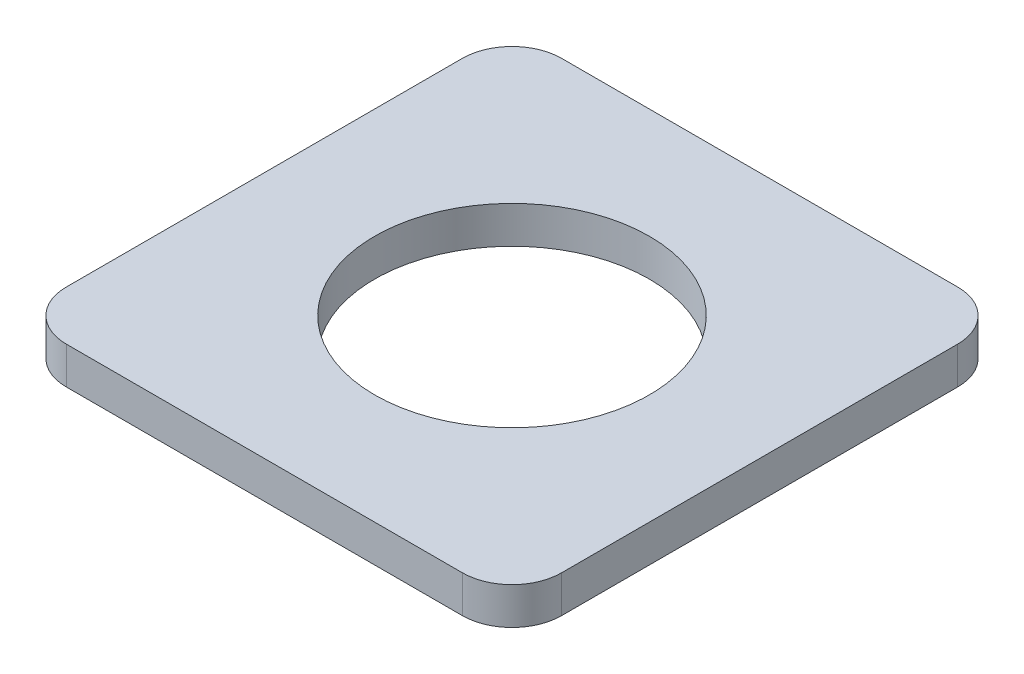
ISO-10303-21;
HEADER;
FILE_DESCRIPTION(('STEP AP214'),'2;1');
FILE_NAME('part.step','',(''),(''),'','','');
FILE_SCHEMA(('AUTOMOTIVE_DESIGN { 1 0 10303 214 1 1 1 1 }'));
ENDSEC;
DATA;
#1=APPLICATION_CONTEXT('core data for automotive mechanical design processes');
#2=APPLICATION_PROTOCOL_DEFINITION('international standard','automotive_design',2000,#1);
#3=PRODUCT_CONTEXT('',#1,'mechanical');
#4=PRODUCT('Part','Part','',(#3));
#5=PRODUCT_RELATED_PRODUCT_CATEGORY('part','',(#4));
#6=PRODUCT_DEFINITION_FORMATION('','',#4);
#7=PRODUCT_DEFINITION_CONTEXT('part definition',#1,'design');
#8=PRODUCT_DEFINITION('design','',#6,#7);
#9=PRODUCT_DEFINITION_SHAPE('','',#8);
#10=(LENGTH_UNIT() NAMED_UNIT(*) SI_UNIT(.MILLI.,.METRE.));
#11=(NAMED_UNIT(*) PLANE_ANGLE_UNIT() SI_UNIT($,.RADIAN.));
#12=(NAMED_UNIT(*) SI_UNIT($,.STERADIAN.) SOLID_ANGLE_UNIT());
#13=UNCERTAINTY_MEASURE_WITH_UNIT(LENGTH_MEASURE(1.E-05),#10,'distance_accuracy_value','');
#14=(GEOMETRIC_REPRESENTATION_CONTEXT(3) GLOBAL_UNCERTAINTY_ASSIGNED_CONTEXT((#13)) GLOBAL_UNIT_ASSIGNED_CONTEXT((#10,
#11,#12)) REPRESENTATION_CONTEXT('',''));
#15=CARTESIAN_POINT('',(0.,0.,0.));
#16=DIRECTION('',(0.,0.,1.));
#17=DIRECTION('',(1.,0.,0.));
#18=AXIS2_PLACEMENT_3D('',#15,#16,#17);
#19=CARTESIAN_POINT('',(-16.,3.,16.));
#20=DIRECTION('',(0.,-1.,0.));
#21=DIRECTION('',(0.,0.,-1.));
#22=AXIS2_PLACEMENT_3D('',#19,#20,#21);
#23=PLANE('',#22);
#24=CARTESIAN_POINT('',(-16.,3.,16.));
#25=DIRECTION('',(0.,1.,0.));
#26=DIRECTION('',(0.,0.,-1.));
#27=AXIS2_PLACEMENT_3D('',#24,#25,#26);
#28=CIRCLE('',#27,4.);
#29=CARTESIAN_POINT('',(-20.,3.,16.));
#30=VERTEX_POINT('',#29);
#31=CARTESIAN_POINT('',(-16.,3.,20.));
#32=VERTEX_POINT('',#31);
#33=EDGE_CURVE('E170',#30,#32,#28,.T.);
#34=ORIENTED_EDGE('',*,*,#33,.T.);
#35=DIRECTION('',(1.,0.,0.));
#36=VECTOR('',#35,1.);
#37=CARTESIAN_POINT('',(-16.,3.,20.));
#38=LINE('',#37,#36);
#39=CARTESIAN_POINT('',(16.,3.,20.));
#40=VERTEX_POINT('',#39);
#41=EDGE_CURVE('E106',#32,#40,#38,.T.);
#42=ORIENTED_EDGE('',*,*,#41,.T.);
#43=CARTESIAN_POINT('',(16.,3.,16.));
#44=DIRECTION('',(0.,1.,0.));
#45=DIRECTION('',(0.,0.,1.));
#46=AXIS2_PLACEMENT_3D('',#43,#44,#45);
#47=CIRCLE('',#46,4.);
#48=CARTESIAN_POINT('',(20.,3.,16.));
#49=VERTEX_POINT('',#48);
#50=EDGE_CURVE('E191',#40,#49,#47,.T.);
#51=ORIENTED_EDGE('',*,*,#50,.T.);
#52=DIRECTION('',(0.,0.,-1.));
#53=VECTOR('',#52,1.);
#54=CARTESIAN_POINT('',(20.,3.,16.));
#55=LINE('',#54,#53);
#56=CARTESIAN_POINT('',(20.,3.,-16.));
#57=VERTEX_POINT('',#56);
#58=EDGE_CURVE('E205',#49,#57,#55,.T.);
#59=ORIENTED_EDGE('',*,*,#58,.T.);
#60=CARTESIAN_POINT('',(16.,3.,-16.));
#61=DIRECTION('',(0.,1.,0.));
#62=DIRECTION('',(0.,0.,-1.));
#63=AXIS2_PLACEMENT_3D('',#60,#61,#62);
#64=CIRCLE('',#63,4.);
#65=CARTESIAN_POINT('',(16.,3.,-20.));
#66=VERTEX_POINT('',#65);
#67=EDGE_CURVE('E125',#57,#66,#64,.T.);
#68=ORIENTED_EDGE('',*,*,#67,.T.);
#69=DIRECTION('',(-1.,0.,0.));
#70=VECTOR('',#69,1.);
#71=CARTESIAN_POINT('',(-16.,3.,-20.));
#72=LINE('',#71,#70);
#73=CARTESIAN_POINT('',(-16.,3.,-20.));
#74=VERTEX_POINT('',#73);
#75=EDGE_CURVE('E119',#66,#74,#72,.T.);
#76=ORIENTED_EDGE('',*,*,#75,.T.);
#77=CARTESIAN_POINT('',(-16.,3.,-16.));
#78=DIRECTION('',(0.,1.,0.));
#79=DIRECTION('',(0.,0.,-1.));
#80=AXIS2_PLACEMENT_3D('',#77,#78,#79);
#81=CIRCLE('',#80,4.);
#82=CARTESIAN_POINT('',(-20.,3.,-16.));
#83=VERTEX_POINT('',#82);
#84=EDGE_CURVE('E123',#74,#83,#81,.T.);
#85=ORIENTED_EDGE('',*,*,#84,.T.);
#86=DIRECTION('',(0.,0.,1.));
#87=VECTOR('',#86,1.);
#88=CARTESIAN_POINT('',(-20.,3.,16.));
#89=LINE('',#88,#87);
#90=EDGE_CURVE('E63',#83,#30,#89,.T.);
#91=ORIENTED_EDGE('',*,*,#90,.T.);
#92=EDGE_LOOP('',(#34,#42,#51,#59,#68,#76,#85,#91));
#93=FACE_BOUND('',#92,.T.);
#94=CARTESIAN_POINT('',(0.,3.,0.));
#95=DIRECTION('',(0.,1.,0.));
#96=DIRECTION('',(0.,0.,1.));
#97=AXIS2_PLACEMENT_3D('',#94,#95,#96);
#98=CIRCLE('',#97,11.1);
#99=CARTESIAN_POINT('',(0.,3.,11.1));
#100=VERTEX_POINT('',#99);
#101=EDGE_CURVE('E152',#100,#100,#98,.T.);
#102=ORIENTED_EDGE('',*,*,#101,.F.);
#103=EDGE_LOOP('',(#102));
#104=FACE_BOUND('',#103,.T.);
#105=ADVANCED_FACE('F45',(#93,#104),#23,.F.);
#106=CARTESIAN_POINT('',(-16.,0.,16.));
#107=DIRECTION('',(0.,-1.,0.));
#108=DIRECTION('',(0.,0.,-1.));
#109=AXIS2_PLACEMENT_3D('',#106,#107,#108);
#110=PLANE('',#109);
#111=CARTESIAN_POINT('',(-16.,0.,16.));
#112=DIRECTION('',(0.,1.,0.));
#113=DIRECTION('',(0.,0.,-1.));
#114=AXIS2_PLACEMENT_3D('',#111,#112,#113);
#115=CIRCLE('',#114,4.);
#116=CARTESIAN_POINT('',(-20.,0.,16.));
#117=VERTEX_POINT('',#116);
#118=CARTESIAN_POINT('',(-16.,0.,20.));
#119=VERTEX_POINT('',#118);
#120=EDGE_CURVE('E147',#117,#119,#115,.T.);
#121=ORIENTED_EDGE('',*,*,#120,.F.);
#122=DIRECTION('',(0.,0.,1.));
#123=VECTOR('',#122,1.);
#124=CARTESIAN_POINT('',(-20.,0.,16.));
#125=LINE('',#124,#123);
#126=CARTESIAN_POINT('',(-20.,0.,-16.));
#127=VERTEX_POINT('',#126);
#128=EDGE_CURVE('E98',#127,#117,#125,.T.);
#129=ORIENTED_EDGE('',*,*,#128,.F.);
#130=CARTESIAN_POINT('',(-16.,0.,-16.));
#131=DIRECTION('',(0.,1.,0.));
#132=DIRECTION('',(0.,0.,-1.));
#133=AXIS2_PLACEMENT_3D('',#130,#131,#132);
#134=CIRCLE('',#133,4.);
#135=CARTESIAN_POINT('',(-16.,0.,-20.));
#136=VERTEX_POINT('',#135);
#137=EDGE_CURVE('E92',#136,#127,#134,.T.);
#138=ORIENTED_EDGE('',*,*,#137,.F.);
#139=DIRECTION('',(-1.,0.,0.));
#140=VECTOR('',#139,1.);
#141=CARTESIAN_POINT('',(-16.,0.,-20.));
#142=LINE('',#141,#140);
#143=CARTESIAN_POINT('',(16.,0.,-20.));
#144=VERTEX_POINT('',#143);
#145=EDGE_CURVE('E134',#144,#136,#142,.T.);
#146=ORIENTED_EDGE('',*,*,#145,.F.);
#147=CARTESIAN_POINT('',(16.,0.,-16.));
#148=DIRECTION('',(0.,1.,0.));
#149=DIRECTION('',(0.,0.,-1.));
#150=AXIS2_PLACEMENT_3D('',#147,#148,#149);
#151=CIRCLE('',#150,4.);
#152=CARTESIAN_POINT('',(20.,0.,-16.));
#153=VERTEX_POINT('',#152);
#154=EDGE_CURVE('E161',#153,#144,#151,.T.);
#155=ORIENTED_EDGE('',*,*,#154,.F.);
#156=DIRECTION('',(0.,0.,-1.));
#157=VECTOR('',#156,1.);
#158=CARTESIAN_POINT('',(20.,0.,16.));
#159=LINE('',#158,#157);
#160=CARTESIAN_POINT('',(20.,0.,16.));
#161=VERTEX_POINT('',#160);
#162=EDGE_CURVE('E158',#161,#153,#159,.T.);
#163=ORIENTED_EDGE('',*,*,#162,.F.);
#164=CARTESIAN_POINT('',(16.,0.,16.));
#165=DIRECTION('',(0.,1.,0.));
#166=DIRECTION('',(0.,0.,1.));
#167=AXIS2_PLACEMENT_3D('',#164,#165,#166);
#168=CIRCLE('',#167,4.);
#169=CARTESIAN_POINT('',(16.,0.,20.));
#170=VERTEX_POINT('',#169);
#171=EDGE_CURVE('E155',#170,#161,#168,.T.);
#172=ORIENTED_EDGE('',*,*,#171,.F.);
#173=DIRECTION('',(1.,0.,0.));
#174=VECTOR('',#173,1.);
#175=CARTESIAN_POINT('',(-16.,0.,20.));
#176=LINE('',#175,#174);
#177=EDGE_CURVE('E151',#119,#170,#176,.T.);
#178=ORIENTED_EDGE('',*,*,#177,.F.);
#179=EDGE_LOOP('',(#121,#129,#138,#146,#155,#163,#172,#178));
#180=FACE_BOUND('',#179,.T.);
#181=CARTESIAN_POINT('',(0.,0.,0.));
#182=DIRECTION('',(0.,1.,0.));
#183=DIRECTION('',(0.,0.,1.));
#184=AXIS2_PLACEMENT_3D('',#181,#182,#183);
#185=CIRCLE('',#184,11.1);
#186=CARTESIAN_POINT('',(0.,0.,11.1));
#187=VERTEX_POINT('',#186);
#188=EDGE_CURVE('E215',#187,#187,#185,.T.);
#189=ORIENTED_EDGE('',*,*,#188,.T.);
#190=EDGE_LOOP('',(#189));
#191=FACE_BOUND('',#190,.T.);
#192=ADVANCED_FACE('F195',(#180,#191),#110,.T.);
#193=CARTESIAN_POINT('',(-16.,3.,16.));
#194=DIRECTION('',(0.,-1.,0.));
#195=DIRECTION('',(0.,0.,-1.));
#196=AXIS2_PLACEMENT_3D('',#193,#194,#195);
#197=CYLINDRICAL_SURFACE('',#196,4.);
#198=ORIENTED_EDGE('',*,*,#120,.T.);
#199=DIRECTION('',(0.,-1.,0.));
#200=VECTOR('',#199,1.);
#201=CARTESIAN_POINT('',(-16.,3.,20.));
#202=LINE('',#201,#200);
#203=EDGE_CURVE('E11',#32,#119,#202,.T.);
#204=ORIENTED_EDGE('',*,*,#203,.F.);
#205=ORIENTED_EDGE('',*,*,#33,.F.);
#206=DIRECTION('',(0.,-1.,0.));
#207=VECTOR('',#206,1.);
#208=CARTESIAN_POINT('',(-20.,3.,16.));
#209=LINE('',#208,#207);
#210=EDGE_CURVE('E143',#30,#117,#209,.T.);
#211=ORIENTED_EDGE('',*,*,#210,.T.);
#212=EDGE_LOOP('',(#198,#204,#205,#211));
#213=FACE_BOUND('',#212,.T.);
#214=ADVANCED_FACE('F47',(#213),#197,.T.);
#215=CARTESIAN_POINT('',(-16.,3.,20.));
#216=DIRECTION('',(0.,0.,-1.));
#217=DIRECTION('',(-1.,0.,0.));
#218=AXIS2_PLACEMENT_3D('',#215,#216,#217);
#219=PLANE('',#218);
#220=ORIENTED_EDGE('',*,*,#177,.T.);
#221=DIRECTION('',(0.,-1.,0.));
#222=VECTOR('',#221,1.);
#223=CARTESIAN_POINT('',(16.,3.,20.));
#224=LINE('',#223,#222);
#225=EDGE_CURVE('E55',#40,#170,#224,.T.);
#226=ORIENTED_EDGE('',*,*,#225,.F.);
#227=ORIENTED_EDGE('',*,*,#41,.F.);
#228=ORIENTED_EDGE('',*,*,#203,.T.);
#229=EDGE_LOOP('',(#220,#226,#227,#228));
#230=FACE_BOUND('',#229,.T.);
#231=ADVANCED_FACE('F245',(#230),#219,.F.);
#232=CARTESIAN_POINT('',(16.,3.,16.));
#233=DIRECTION('',(0.,-1.,0.));
#234=DIRECTION('',(0.,0.,-1.));
#235=AXIS2_PLACEMENT_3D('',#232,#233,#234);
#236=CYLINDRICAL_SURFACE('',#235,4.);
#237=ORIENTED_EDGE('',*,*,#171,.T.);
#238=DIRECTION('',(0.,-1.,0.));
#239=VECTOR('',#238,1.);
#240=CARTESIAN_POINT('',(20.,3.,16.));
#241=LINE('',#240,#239);
#242=EDGE_CURVE('E181',#49,#161,#241,.T.);
#243=ORIENTED_EDGE('',*,*,#242,.F.);
#244=ORIENTED_EDGE('',*,*,#50,.F.);
#245=ORIENTED_EDGE('',*,*,#225,.T.);
#246=EDGE_LOOP('',(#237,#243,#244,#245));
#247=FACE_BOUND('',#246,.T.);
#248=ADVANCED_FACE('F189',(#247),#236,.T.);
#249=CARTESIAN_POINT('',(20.,3.,16.));
#250=DIRECTION('',(-1.,0.,0.));
#251=DIRECTION('',(0.,0.,1.));
#252=AXIS2_PLACEMENT_3D('',#249,#250,#251);
#253=PLANE('',#252);
#254=ORIENTED_EDGE('',*,*,#162,.T.);
#255=DIRECTION('',(0.,-1.,0.));
#256=VECTOR('',#255,1.);
#257=CARTESIAN_POINT('',(20.,3.,-16.));
#258=LINE('',#257,#256);
#259=EDGE_CURVE('E177',#57,#153,#258,.T.);
#260=ORIENTED_EDGE('',*,*,#259,.F.);
#261=ORIENTED_EDGE('',*,*,#58,.F.);
#262=ORIENTED_EDGE('',*,*,#242,.T.);
#263=EDGE_LOOP('',(#254,#260,#261,#262));
#264=FACE_BOUND('',#263,.T.);
#265=ADVANCED_FACE('F200',(#264),#253,.F.);
#266=CARTESIAN_POINT('',(16.,3.,-16.));
#267=DIRECTION('',(0.,-1.,0.));
#268=DIRECTION('',(0.,0.,-1.));
#269=AXIS2_PLACEMENT_3D('',#266,#267,#268);
#270=CYLINDRICAL_SURFACE('',#269,4.);
#271=ORIENTED_EDGE('',*,*,#154,.T.);
#272=DIRECTION('',(0.,-1.,0.));
#273=VECTOR('',#272,1.);
#274=CARTESIAN_POINT('',(16.,3.,-20.));
#275=LINE('',#274,#273);
#276=EDGE_CURVE('E136',#66,#144,#275,.T.);
#277=ORIENTED_EDGE('',*,*,#276,.F.);
#278=ORIENTED_EDGE('',*,*,#67,.F.);
#279=ORIENTED_EDGE('',*,*,#259,.T.);
#280=EDGE_LOOP('',(#271,#277,#278,#279));
#281=FACE_BOUND('',#280,.T.);
#282=ADVANCED_FACE('F203',(#281),#270,.T.);
#283=CARTESIAN_POINT('',(-16.,3.,-20.));
#284=DIRECTION('',(0.,0.,1.));
#285=DIRECTION('',(1.,0.,0.));
#286=AXIS2_PLACEMENT_3D('',#283,#284,#285);
#287=PLANE('',#286);
#288=ORIENTED_EDGE('',*,*,#145,.T.);
#289=DIRECTION('',(0.,-1.,0.));
#290=VECTOR('',#289,1.);
#291=CARTESIAN_POINT('',(-16.,3.,-20.));
#292=LINE('',#291,#290);
#293=EDGE_CURVE('E131',#74,#136,#292,.T.);
#294=ORIENTED_EDGE('',*,*,#293,.F.);
#295=ORIENTED_EDGE('',*,*,#75,.F.);
#296=ORIENTED_EDGE('',*,*,#276,.T.);
#297=EDGE_LOOP('',(#288,#294,#295,#296));
#298=FACE_BOUND('',#297,.T.);
#299=ADVANCED_FACE('F132',(#298),#287,.F.);
#300=CARTESIAN_POINT('',(-16.,3.,-16.));
#301=DIRECTION('',(0.,-1.,0.));
#302=DIRECTION('',(0.,0.,-1.));
#303=AXIS2_PLACEMENT_3D('',#300,#301,#302);
#304=CYLINDRICAL_SURFACE('',#303,4.);
#305=ORIENTED_EDGE('',*,*,#137,.T.);
#306=DIRECTION('',(0.,-1.,0.));
#307=VECTOR('',#306,1.);
#308=CARTESIAN_POINT('',(-20.,3.,-16.));
#309=LINE('',#308,#307);
#310=EDGE_CURVE('E137',#83,#127,#309,.T.);
#311=ORIENTED_EDGE('',*,*,#310,.F.);
#312=ORIENTED_EDGE('',*,*,#84,.F.);
#313=ORIENTED_EDGE('',*,*,#293,.T.);
#314=EDGE_LOOP('',(#305,#311,#312,#313));
#315=FACE_BOUND('',#314,.T.);
#316=ADVANCED_FACE('F139',(#315),#304,.T.);
#317=CARTESIAN_POINT('',(-20.,3.,16.));
#318=DIRECTION('',(1.,0.,0.));
#319=DIRECTION('',(0.,0.,-1.));
#320=AXIS2_PLACEMENT_3D('',#317,#318,#319);
#321=PLANE('',#320);
#322=ORIENTED_EDGE('',*,*,#128,.T.);
#323=ORIENTED_EDGE('',*,*,#210,.F.);
#324=ORIENTED_EDGE('',*,*,#90,.F.);
#325=ORIENTED_EDGE('',*,*,#310,.T.);
#326=EDGE_LOOP('',(#322,#323,#324,#325));
#327=FACE_BOUND('',#326,.T.);
#328=ADVANCED_FACE('F233',(#327),#321,.F.);
#329=CARTESIAN_POINT('',(0.,3.,0.));
#330=DIRECTION('',(0.,-1.,0.));
#331=DIRECTION('',(0.,0.,-1.));
#332=AXIS2_PLACEMENT_3D('',#329,#330,#331);
#333=CYLINDRICAL_SURFACE('',#332,11.1);
#334=ORIENTED_EDGE('',*,*,#101,.T.);
#335=EDGE_LOOP('',(#334));
#336=FACE_BOUND('',#335,.T.);
#337=ORIENTED_EDGE('',*,*,#188,.F.);
#338=EDGE_LOOP('',(#337));
#339=FACE_BOUND('',#338,.T.);
#340=ADVANCED_FACE('F223',(#336,#339),#333,.F.);
#341=CLOSED_SHELL('',(#105,#192,#214,#231,#248,#265,#282,#299,#316,#328,#340));
#342=MANIFOLD_SOLID_BREP('B2',#341);
#343=ADVANCED_BREP_SHAPE_REPRESENTATION('',(#18,#342),#14);
#344=SHAPE_DEFINITION_REPRESENTATION(#9,#343);
ENDSEC;
END-ISO-10303-21;
